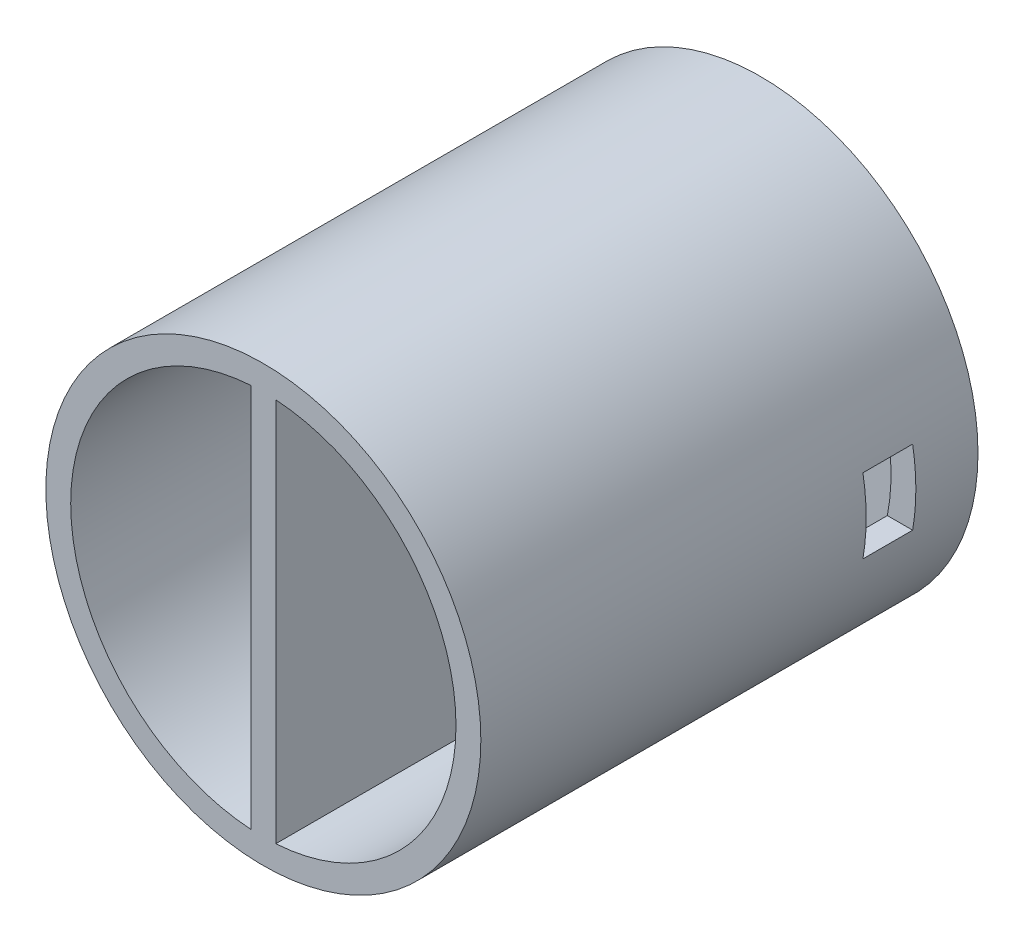
ISO-10303-21;
HEADER;
FILE_DESCRIPTION(('STEP AP214'),'2;1');
FILE_NAME('part.step','',(''),(''),'','','');
FILE_SCHEMA(('AUTOMOTIVE_DESIGN { 1 0 10303 214 1 1 1 1 }'));
ENDSEC;
DATA;
#1=APPLICATION_CONTEXT('core data for automotive mechanical design processes');
#2=APPLICATION_PROTOCOL_DEFINITION('international standard','automotive_design',2000,#1);
#3=PRODUCT_CONTEXT('',#1,'mechanical');
#4=PRODUCT('Part','Part','',(#3));
#5=PRODUCT_RELATED_PRODUCT_CATEGORY('part','',(#4));
#6=PRODUCT_DEFINITION_FORMATION('','',#4);
#7=PRODUCT_DEFINITION_CONTEXT('part definition',#1,'design');
#8=PRODUCT_DEFINITION('design','',#6,#7);
#9=PRODUCT_DEFINITION_SHAPE('','',#8);
#10=(LENGTH_UNIT() NAMED_UNIT(*) SI_UNIT(.MILLI.,.METRE.));
#11=(NAMED_UNIT(*) PLANE_ANGLE_UNIT() SI_UNIT($,.RADIAN.));
#12=(NAMED_UNIT(*) SI_UNIT($,.STERADIAN.) SOLID_ANGLE_UNIT());
#13=UNCERTAINTY_MEASURE_WITH_UNIT(LENGTH_MEASURE(1.E-05),#10,'distance_accuracy_value','');
#14=(GEOMETRIC_REPRESENTATION_CONTEXT(3) GLOBAL_UNCERTAINTY_ASSIGNED_CONTEXT((#13)) GLOBAL_UNIT_ASSIGNED_CONTEXT((#10,
#11,#12)) REPRESENTATION_CONTEXT('',''));
#15=CARTESIAN_POINT('',(0.,0.,0.));
#16=DIRECTION('',(0.,0.,1.));
#17=DIRECTION('',(1.,0.,0.));
#18=AXIS2_PLACEMENT_3D('',#15,#16,#17);
#19=CARTESIAN_POINT('',(0.,0.,2.));
#20=DIRECTION('',(0.,0.,-1.));
#21=DIRECTION('',(-1.,0.,0.));
#22=AXIS2_PLACEMENT_3D('',#19,#20,#21);
#23=CYLINDRICAL_SURFACE('',#22,17.5);
#24=DIRECTION('',(0.,0.,-1.));
#25=VECTOR('',#24,1.);
#26=CARTESIAN_POINT('',(17.2409396495667,3.,2.));
#27=LINE('',#26,#25);
#28=CARTESIAN_POINT('',(17.2409396495667,3.,9.));
#29=VERTEX_POINT('',#28);
#30=CARTESIAN_POINT('',(17.2409396495667,3.,5.));
#31=VERTEX_POINT('',#30);
#32=EDGE_CURVE('E184',#29,#31,#27,.T.);
#33=ORIENTED_EDGE('',*,*,#32,.T.);
#34=CARTESIAN_POINT('',(0.,0.,5.));
#35=DIRECTION('',(0.,0.,-1.));
#36=DIRECTION('',(0.,1.,0.));
#37=AXIS2_PLACEMENT_3D('',#34,#35,#36);
#38=CIRCLE('',#37,17.5);
#39=CARTESIAN_POINT('',(17.2409396495667,-3.,5.));
#40=VERTEX_POINT('',#39);
#41=EDGE_CURVE('E218',#31,#40,#38,.T.);
#42=ORIENTED_EDGE('',*,*,#41,.T.);
#43=DIRECTION('',(0.,0.,-1.));
#44=VECTOR('',#43,1.);
#45=CARTESIAN_POINT('',(17.2409396495667,-3.,2.));
#46=LINE('',#45,#44);
#47=CARTESIAN_POINT('',(17.2409396495667,-3.,9.));
#48=VERTEX_POINT('',#47);
#49=EDGE_CURVE('E186',#40,#48,#46,.F.);
#50=ORIENTED_EDGE('',*,*,#49,.T.);
#51=CARTESIAN_POINT('',(0.,0.,9.));
#52=DIRECTION('',(0.,0.,1.));
#53=DIRECTION('',(1.,0.,0.));
#54=AXIS2_PLACEMENT_3D('',#51,#52,#53);
#55=CIRCLE('',#54,17.5);
#56=EDGE_CURVE('E182',#48,#29,#55,.T.);
#57=ORIENTED_EDGE('',*,*,#56,.T.);
#58=EDGE_LOOP('',(#33,#42,#50,#57));
#59=FACE_BOUND('',#58,.T.);
#60=CARTESIAN_POINT('',(0.,0.,0.));
#61=DIRECTION('',(0.,0.,1.));
#62=DIRECTION('',(1.,0.,0.));
#63=AXIS2_PLACEMENT_3D('',#60,#61,#62);
#64=CIRCLE('',#63,17.5);
#65=CARTESIAN_POINT('',(17.5,0.,0.));
#66=VERTEX_POINT('',#65);
#67=EDGE_CURVE('E11',#66,#66,#64,.T.);
#68=ORIENTED_EDGE('',*,*,#67,.T.);
#69=EDGE_LOOP('',(#68));
#70=FACE_BOUND('',#69,.T.);
#71=CARTESIAN_POINT('',(0.,0.,40.));
#72=DIRECTION('',(0.,0.,1.));
#73=DIRECTION('',(1.,0.,0.));
#74=AXIS2_PLACEMENT_3D('',#71,#72,#73);
#75=CIRCLE('',#74,17.5);
#76=CARTESIAN_POINT('',(17.5,0.,40.));
#77=VERTEX_POINT('',#76);
#78=EDGE_CURVE('E53',#77,#77,#75,.T.);
#79=ORIENTED_EDGE('',*,*,#78,.F.);
#80=EDGE_LOOP('',(#79));
#81=FACE_BOUND('',#80,.T.);
#82=CARTESIAN_POINT('',(0.,0.,9.));
#83=DIRECTION('',(0.,0.,-1.));
#84=DIRECTION('',(-1.,0.,0.));
#85=AXIS2_PLACEMENT_3D('',#82,#83,#84);
#86=CIRCLE('',#85,17.5);
#87=CARTESIAN_POINT('',(-17.2409396495667,-3.,9.));
#88=VERTEX_POINT('',#87);
#89=CARTESIAN_POINT('',(-17.2409396495667,3.,9.));
#90=VERTEX_POINT('',#89);
#91=EDGE_CURVE('E268',#88,#90,#86,.T.);
#92=ORIENTED_EDGE('',*,*,#91,.F.);
#93=DIRECTION('',(0.,0.,-1.));
#94=VECTOR('',#93,1.);
#95=CARTESIAN_POINT('',(-17.2409396495667,-3.,2.));
#96=LINE('',#95,#94);
#97=CARTESIAN_POINT('',(-17.2409396495667,-3.,5.));
#98=VERTEX_POINT('',#97);
#99=EDGE_CURVE('E246',#98,#88,#96,.F.);
#100=ORIENTED_EDGE('',*,*,#99,.F.);
#101=CARTESIAN_POINT('',(0.,0.,5.));
#102=DIRECTION('',(0.,0.,1.));
#103=DIRECTION('',(0.,-1.,0.));
#104=AXIS2_PLACEMENT_3D('',#101,#102,#103);
#105=CIRCLE('',#104,17.5);
#106=CARTESIAN_POINT('',(-17.2409396495667,3.,5.));
#107=VERTEX_POINT('',#106);
#108=EDGE_CURVE('E254',#107,#98,#105,.T.);
#109=ORIENTED_EDGE('',*,*,#108,.F.);
#110=DIRECTION('',(0.,0.,-1.));
#111=VECTOR('',#110,1.);
#112=CARTESIAN_POINT('',(-17.2409396495667,3.,2.));
#113=LINE('',#112,#111);
#114=EDGE_CURVE('E261',#90,#107,#113,.T.);
#115=ORIENTED_EDGE('',*,*,#114,.F.);
#116=EDGE_LOOP('',(#92,#100,#109,#115));
#117=FACE_BOUND('',#116,.T.);
#118=ADVANCED_FACE('F45',(#59,#70,#81,#117),#23,.T.);
#119=CARTESIAN_POINT('',(0.,0.,40.));
#120=DIRECTION('',(0.,0.,-1.));
#121=DIRECTION('',(-1.,0.,0.));
#122=AXIS2_PLACEMENT_3D('',#119,#120,#121);
#123=CYLINDRICAL_SURFACE('',#122,15.5);
#124=CARTESIAN_POINT('',(0.,0.,2.));
#125=DIRECTION('',(0.,0.,1.));
#126=DIRECTION('',(1.,0.,0.));
#127=AXIS2_PLACEMENT_3D('',#124,#125,#126);
#128=CIRCLE('',#127,15.5);
#129=CARTESIAN_POINT('',(-1.,15.467708298258,2.));
#130=VERTEX_POINT('',#129);
#131=CARTESIAN_POINT('',(-0.999999999999998,-15.467708298258,2.));
#132=VERTEX_POINT('',#131);
#133=EDGE_CURVE('E380',#130,#132,#128,.T.);
#134=ORIENTED_EDGE('',*,*,#133,.F.);
#135=DIRECTION('',(0.,0.,-1.));
#136=VECTOR('',#135,1.);
#137=CARTESIAN_POINT('',(-1.,15.467708298258,40.));
#138=LINE('',#137,#136);
#139=CARTESIAN_POINT('',(-1.,15.467708298258,40.));
#140=VERTEX_POINT('',#139);
#141=EDGE_CURVE('E389',#140,#130,#138,.T.);
#142=ORIENTED_EDGE('',*,*,#141,.F.);
#143=CARTESIAN_POINT('',(0.,0.,40.));
#144=DIRECTION('',(0.,0.,1.));
#145=DIRECTION('',(1.,0.,0.));
#146=AXIS2_PLACEMENT_3D('',#143,#144,#145);
#147=CIRCLE('',#146,15.5);
#148=CARTESIAN_POINT('',(-0.999999999999998,-15.467708298258,40.));
#149=VERTEX_POINT('',#148);
#150=EDGE_CURVE('E381',#140,#149,#147,.T.);
#151=ORIENTED_EDGE('',*,*,#150,.T.);
#152=DIRECTION('',(0.,0.,-1.));
#153=VECTOR('',#152,1.);
#154=CARTESIAN_POINT('',(-0.999999999999998,-15.467708298258,40.));
#155=LINE('',#154,#153);
#156=EDGE_CURVE('E397',#149,#132,#155,.T.);
#157=ORIENTED_EDGE('',*,*,#156,.T.);
#158=EDGE_LOOP('',(#134,#142,#151,#157));
#159=FACE_BOUND('',#158,.T.);
#160=DIRECTION('',(0.,0.,-1.));
#161=VECTOR('',#160,1.);
#162=CARTESIAN_POINT('',(-15.2069063257455,-3.,40.));
#163=LINE('',#162,#161);
#164=CARTESIAN_POINT('',(-15.2069063257455,-3.,5.));
#165=VERTEX_POINT('',#164);
#166=CARTESIAN_POINT('',(-15.2069063257455,-3.,9.));
#167=VERTEX_POINT('',#166);
#168=EDGE_CURVE('E242',#165,#167,#163,.F.);
#169=ORIENTED_EDGE('',*,*,#168,.T.);
#170=CARTESIAN_POINT('',(0.,0.,9.));
#171=DIRECTION('',(0.,0.,-1.));
#172=DIRECTION('',(-1.,0.,0.));
#173=AXIS2_PLACEMENT_3D('',#170,#171,#172);
#174=CIRCLE('',#173,15.5);
#175=CARTESIAN_POINT('',(-15.2069063257455,3.,9.));
#176=VERTEX_POINT('',#175);
#177=EDGE_CURVE('E264',#167,#176,#174,.T.);
#178=ORIENTED_EDGE('',*,*,#177,.T.);
#179=DIRECTION('',(0.,0.,-1.));
#180=VECTOR('',#179,1.);
#181=CARTESIAN_POINT('',(-15.2069063257455,3.,40.));
#182=LINE('',#181,#180);
#183=CARTESIAN_POINT('',(-15.2069063257455,3.,5.));
#184=VERTEX_POINT('',#183);
#185=EDGE_CURVE('E257',#176,#184,#182,.T.);
#186=ORIENTED_EDGE('',*,*,#185,.T.);
#187=CARTESIAN_POINT('',(0.,0.,5.));
#188=DIRECTION('',(0.,0.,1.));
#189=DIRECTION('',(0.,-1.,0.));
#190=AXIS2_PLACEMENT_3D('',#187,#188,#189);
#191=CIRCLE('',#190,15.5);
#192=EDGE_CURVE('E250',#184,#165,#191,.T.);
#193=ORIENTED_EDGE('',*,*,#192,.T.);
#194=EDGE_LOOP('',(#169,#178,#186,#193));
#195=FACE_BOUND('',#194,.T.);
#196=ADVANCED_FACE('F409',(#159,#195),#123,.F.);
#197=CARTESIAN_POINT('',(0.,0.,0.));
#198=DIRECTION('',(0.,0.,1.));
#199=DIRECTION('',(1.,0.,0.));
#200=AXIS2_PLACEMENT_3D('',#197,#198,#199);
#201=PLANE('',#200);
#202=DIRECTION('',(1.,0.,0.));
#203=VECTOR('',#202,1.);
#204=CARTESIAN_POINT('',(5.,-3.,0.));
#205=LINE('',#204,#203);
#206=CARTESIAN_POINT('',(5.,-3.,0.));
#207=VERTEX_POINT('',#206);
#208=CARTESIAN_POINT('',(9.,-3.,0.));
#209=VERTEX_POINT('',#208);
#210=EDGE_CURVE('E285',#207,#209,#205,.T.);
#211=ORIENTED_EDGE('',*,*,#210,.T.);
#212=DIRECTION('',(0.,1.,0.));
#213=VECTOR('',#212,1.);
#214=CARTESIAN_POINT('',(9.,3.,0.));
#215=LINE('',#214,#213);
#216=CARTESIAN_POINT('',(9.,3.,0.));
#217=VERTEX_POINT('',#216);
#218=EDGE_CURVE('E272',#209,#217,#215,.T.);
#219=ORIENTED_EDGE('',*,*,#218,.T.);
#220=DIRECTION('',(-1.,0.,0.));
#221=VECTOR('',#220,1.);
#222=CARTESIAN_POINT('',(5.,3.,0.));
#223=LINE('',#222,#221);
#224=CARTESIAN_POINT('',(5.,3.,0.));
#225=VERTEX_POINT('',#224);
#226=EDGE_CURVE('E276',#217,#225,#223,.T.);
#227=ORIENTED_EDGE('',*,*,#226,.T.);
#228=DIRECTION('',(0.,-1.,0.));
#229=VECTOR('',#228,1.);
#230=CARTESIAN_POINT('',(5.,3.,0.));
#231=LINE('',#230,#229);
#232=EDGE_CURVE('E281',#225,#207,#231,.T.);
#233=ORIENTED_EDGE('',*,*,#232,.T.);
#234=EDGE_LOOP('',(#211,#219,#227,#233));
#235=FACE_BOUND('',#234,.T.);
#236=DIRECTION('',(1.,0.,0.));
#237=VECTOR('',#236,1.);
#238=CARTESIAN_POINT('',(-5.,-3.,0.));
#239=LINE('',#238,#237);
#240=CARTESIAN_POINT('',(-9.,-3.,0.));
#241=VERTEX_POINT('',#240);
#242=CARTESIAN_POINT('',(-5.,-3.,0.));
#243=VERTEX_POINT('',#242);
#244=EDGE_CURVE('E322',#241,#243,#239,.T.);
#245=ORIENTED_EDGE('',*,*,#244,.T.);
#246=DIRECTION('',(0.,1.,0.));
#247=VECTOR('',#246,1.);
#248=CARTESIAN_POINT('',(-5.,3.,0.));
#249=LINE('',#248,#247);
#250=CARTESIAN_POINT('',(-5.,3.,0.));
#251=VERTEX_POINT('',#250);
#252=EDGE_CURVE('E336',#243,#251,#249,.T.);
#253=ORIENTED_EDGE('',*,*,#252,.T.);
#254=DIRECTION('',(-1.,0.,0.));
#255=VECTOR('',#254,1.);
#256=CARTESIAN_POINT('',(-5.,3.,0.));
#257=LINE('',#256,#255);
#258=CARTESIAN_POINT('',(-9.,3.,0.));
#259=VERTEX_POINT('',#258);
#260=EDGE_CURVE('E353',#251,#259,#257,.T.);
#261=ORIENTED_EDGE('',*,*,#260,.T.);
#262=DIRECTION('',(0.,-1.,0.));
#263=VECTOR('',#262,1.);
#264=CARTESIAN_POINT('',(-9.,3.,0.));
#265=LINE('',#264,#263);
#266=EDGE_CURVE('E349',#259,#241,#265,.T.);
#267=ORIENTED_EDGE('',*,*,#266,.T.);
#268=EDGE_LOOP('',(#245,#253,#261,#267));
#269=FACE_BOUND('',#268,.T.);
#270=ORIENTED_EDGE('',*,*,#67,.F.);
#271=EDGE_LOOP('',(#270));
#272=FACE_BOUND('',#271,.T.);
#273=ADVANCED_FACE('F485',(#235,#269,#272),#201,.F.);
#274=CARTESIAN_POINT('',(0.,0.,40.));
#275=DIRECTION('',(0.,0.,1.));
#276=DIRECTION('',(1.,0.,0.));
#277=AXIS2_PLACEMENT_3D('',#274,#275,#276);
#278=PLANE('',#277);
#279=ORIENTED_EDGE('',*,*,#78,.T.);
#280=EDGE_LOOP('',(#279));
#281=FACE_BOUND('',#280,.T.);
#282=DIRECTION('',(0.,1.,0.));
#283=VECTOR('',#282,1.);
#284=CARTESIAN_POINT('',(-1.,15.467708298258,40.));
#285=LINE('',#284,#283);
#286=EDGE_CURVE('E385',#149,#140,#285,.T.);
#287=ORIENTED_EDGE('',*,*,#286,.F.);
#288=ORIENTED_EDGE('',*,*,#150,.F.);
#289=EDGE_LOOP('',(#287,#288));
#290=FACE_BOUND('',#289,.T.);
#291=DIRECTION('',(0.,-1.,0.));
#292=VECTOR('',#291,1.);
#293=CARTESIAN_POINT('',(0.999999999999999,15.467708298258,40.));
#294=LINE('',#293,#292);
#295=CARTESIAN_POINT('',(0.999999999999999,15.467708298258,40.));
#296=VERTEX_POINT('',#295);
#297=CARTESIAN_POINT('',(1.,-15.467708298258,40.));
#298=VERTEX_POINT('',#297);
#299=EDGE_CURVE('E364',#296,#298,#294,.T.);
#300=ORIENTED_EDGE('',*,*,#299,.F.);
#301=CARTESIAN_POINT('',(0.,0.,40.));
#302=DIRECTION('',(0.,0.,1.));
#303=DIRECTION('',(1.,0.,0.));
#304=AXIS2_PLACEMENT_3D('',#301,#302,#303);
#305=CIRCLE('',#304,15.5);
#306=EDGE_CURVE('E360',#298,#296,#305,.T.);
#307=ORIENTED_EDGE('',*,*,#306,.F.);
#308=EDGE_LOOP('',(#300,#307));
#309=FACE_BOUND('',#308,.T.);
#310=ADVANCED_FACE('F404',(#281,#290,#309),#278,.T.);
#311=CARTESIAN_POINT('',(-1.,15.467708298258,40.));
#312=DIRECTION('',(-1.,0.,0.));
#313=DIRECTION('',(0.,-1.,0.));
#314=AXIS2_PLACEMENT_3D('',#311,#312,#313);
#315=PLANE('',#314);
#316=DIRECTION('',(0.,1.,0.));
#317=VECTOR('',#316,1.);
#318=CARTESIAN_POINT('',(-1.,15.467708298258,2.));
#319=LINE('',#318,#317);
#320=EDGE_CURVE('E386',#132,#130,#319,.T.);
#321=ORIENTED_EDGE('',*,*,#320,.F.);
#322=ORIENTED_EDGE('',*,*,#156,.F.);
#323=ORIENTED_EDGE('',*,*,#286,.T.);
#324=ORIENTED_EDGE('',*,*,#141,.T.);
#325=EDGE_LOOP('',(#321,#322,#323,#324));
#326=FACE_BOUND('',#325,.T.);
#327=ADVANCED_FACE('F478',(#326),#315,.T.);
#328=CARTESIAN_POINT('',(0.,0.,40.));
#329=DIRECTION('',(0.,0.,-1.));
#330=DIRECTION('',(-1.,0.,0.));
#331=AXIS2_PLACEMENT_3D('',#328,#329,#330);
#332=CYLINDRICAL_SURFACE('',#331,15.5);
#333=CARTESIAN_POINT('',(0.,0.,9.));
#334=DIRECTION('',(0.,0.,1.));
#335=DIRECTION('',(1.,0.,0.));
#336=AXIS2_PLACEMENT_3D('',#333,#334,#335);
#337=CIRCLE('',#336,15.5);
#338=CARTESIAN_POINT('',(15.2069063257455,-3.,9.));
#339=VERTEX_POINT('',#338);
#340=CARTESIAN_POINT('',(15.2069063257455,3.,9.));
#341=VERTEX_POINT('',#340);
#342=EDGE_CURVE('E192',#339,#341,#337,.T.);
#343=ORIENTED_EDGE('',*,*,#342,.F.);
#344=DIRECTION('',(0.,0.,-1.));
#345=VECTOR('',#344,1.);
#346=CARTESIAN_POINT('',(15.2069063257455,-3.,40.));
#347=LINE('',#346,#345);
#348=CARTESIAN_POINT('',(15.2069063257455,-3.,5.));
#349=VERTEX_POINT('',#348);
#350=EDGE_CURVE('E221',#349,#339,#347,.F.);
#351=ORIENTED_EDGE('',*,*,#350,.F.);
#352=CARTESIAN_POINT('',(0.,0.,5.));
#353=DIRECTION('',(0.,0.,-1.));
#354=DIRECTION('',(0.,1.,0.));
#355=AXIS2_PLACEMENT_3D('',#352,#353,#354);
#356=CIRCLE('',#355,15.5);
#357=CARTESIAN_POINT('',(15.2069063257455,3.,5.));
#358=VERTEX_POINT('',#357);
#359=EDGE_CURVE('E196',#358,#349,#356,.T.);
#360=ORIENTED_EDGE('',*,*,#359,.F.);
#361=DIRECTION('',(0.,0.,-1.));
#362=VECTOR('',#361,1.);
#363=CARTESIAN_POINT('',(15.2069063257455,3.,40.));
#364=LINE('',#363,#362);
#365=EDGE_CURVE('E197',#341,#358,#364,.T.);
#366=ORIENTED_EDGE('',*,*,#365,.F.);
#367=EDGE_LOOP('',(#343,#351,#360,#366));
#368=FACE_BOUND('',#367,.T.);
#369=CARTESIAN_POINT('',(0.,0.,2.));
#370=DIRECTION('',(0.,0.,1.));
#371=DIRECTION('',(1.,0.,0.));
#372=AXIS2_PLACEMENT_3D('',#369,#370,#371);
#373=CIRCLE('',#372,15.5);
#374=CARTESIAN_POINT('',(1.,-15.467708298258,2.));
#375=VERTEX_POINT('',#374);
#376=CARTESIAN_POINT('',(0.999999999999999,15.467708298258,2.));
#377=VERTEX_POINT('',#376);
#378=EDGE_CURVE('E308',#375,#377,#373,.T.);
#379=ORIENTED_EDGE('',*,*,#378,.F.);
#380=DIRECTION('',(0.,0.,-1.));
#381=VECTOR('',#380,1.);
#382=CARTESIAN_POINT('',(1.,-15.467708298258,40.));
#383=LINE('',#382,#381);
#384=EDGE_CURVE('E368',#298,#375,#383,.T.);
#385=ORIENTED_EDGE('',*,*,#384,.F.);
#386=ORIENTED_EDGE('',*,*,#306,.T.);
#387=DIRECTION('',(0.,0.,-1.));
#388=VECTOR('',#387,1.);
#389=CARTESIAN_POINT('',(0.999999999999999,15.467708298258,40.));
#390=LINE('',#389,#388);
#391=EDGE_CURVE('E376',#296,#377,#390,.T.);
#392=ORIENTED_EDGE('',*,*,#391,.T.);
#393=EDGE_LOOP('',(#379,#385,#386,#392));
#394=FACE_BOUND('',#393,.T.);
#395=ADVANCED_FACE('F474',(#368,#394),#332,.F.);
#396=CARTESIAN_POINT('',(0.999999999999999,15.467708298258,40.));
#397=DIRECTION('',(1.,0.,0.));
#398=DIRECTION('',(0.,1.,0.));
#399=AXIS2_PLACEMENT_3D('',#396,#397,#398);
#400=PLANE('',#399);
#401=DIRECTION('',(0.,-1.,0.));
#402=VECTOR('',#401,1.);
#403=CARTESIAN_POINT('',(0.999999999999999,15.467708298258,2.));
#404=LINE('',#403,#402);
#405=EDGE_CURVE('E365',#377,#375,#404,.T.);
#406=ORIENTED_EDGE('',*,*,#405,.F.);
#407=ORIENTED_EDGE('',*,*,#391,.F.);
#408=ORIENTED_EDGE('',*,*,#299,.T.);
#409=ORIENTED_EDGE('',*,*,#384,.T.);
#410=EDGE_LOOP('',(#406,#407,#408,#409));
#411=FACE_BOUND('',#410,.T.);
#412=ADVANCED_FACE('F470',(#411),#400,.T.);
#413=CARTESIAN_POINT('',(0.,0.,2.));
#414=DIRECTION('',(0.,0.,1.));
#415=DIRECTION('',(1.,0.,0.));
#416=AXIS2_PLACEMENT_3D('',#413,#414,#415);
#417=PLANE('',#416);
#418=DIRECTION('',(0.,1.,0.));
#419=VECTOR('',#418,1.);
#420=CARTESIAN_POINT('',(9.,3.,2.));
#421=LINE('',#420,#419);
#422=CARTESIAN_POINT('',(9.,-3.,2.));
#423=VERTEX_POINT('',#422);
#424=CARTESIAN_POINT('',(9.,3.,2.));
#425=VERTEX_POINT('',#424);
#426=EDGE_CURVE('E290',#423,#425,#421,.T.);
#427=ORIENTED_EDGE('',*,*,#426,.F.);
#428=DIRECTION('',(1.,0.,0.));
#429=VECTOR('',#428,1.);
#430=CARTESIAN_POINT('',(5.,-3.,2.));
#431=LINE('',#430,#429);
#432=CARTESIAN_POINT('',(5.,-3.,2.));
#433=VERTEX_POINT('',#432);
#434=EDGE_CURVE('E277',#433,#423,#431,.T.);
#435=ORIENTED_EDGE('',*,*,#434,.F.);
#436=DIRECTION('',(0.,-1.,0.));
#437=VECTOR('',#436,1.);
#438=CARTESIAN_POINT('',(5.,3.,2.));
#439=LINE('',#438,#437);
#440=CARTESIAN_POINT('',(5.,3.,2.));
#441=VERTEX_POINT('',#440);
#442=EDGE_CURVE('E298',#441,#433,#439,.T.);
#443=ORIENTED_EDGE('',*,*,#442,.F.);
#444=DIRECTION('',(-1.,0.,0.));
#445=VECTOR('',#444,1.);
#446=CARTESIAN_POINT('',(5.,3.,2.));
#447=LINE('',#446,#445);
#448=EDGE_CURVE('E293',#425,#441,#447,.T.);
#449=ORIENTED_EDGE('',*,*,#448,.F.);
#450=EDGE_LOOP('',(#427,#435,#443,#449));
#451=FACE_BOUND('',#450,.T.);
#452=ORIENTED_EDGE('',*,*,#378,.T.);
#453=ORIENTED_EDGE('',*,*,#405,.T.);
#454=EDGE_LOOP('',(#452,#453));
#455=FACE_BOUND('',#454,.T.);
#456=ADVANCED_FACE('F473',(#451,#455),#417,.T.);
#457=DIRECTION('',(0.,1.,0.));
#458=VECTOR('',#457,1.);
#459=CARTESIAN_POINT('',(-5.,3.,2.));
#460=LINE('',#459,#458);
#461=CARTESIAN_POINT('',(-5.,-3.,2.));
#462=VERTEX_POINT('',#461);
#463=CARTESIAN_POINT('',(-5.,3.,2.));
#464=VERTEX_POINT('',#463);
#465=EDGE_CURVE('E294',#462,#464,#460,.T.);
#466=ORIENTED_EDGE('',*,*,#465,.F.);
#467=DIRECTION('',(1.,0.,0.));
#468=VECTOR('',#467,1.);
#469=CARTESIAN_POINT('',(-5.,-3.,2.));
#470=LINE('',#469,#468);
#471=CARTESIAN_POINT('',(-9.,-3.,2.));
#472=VERTEX_POINT('',#471);
#473=EDGE_CURVE('E331',#472,#462,#470,.T.);
#474=ORIENTED_EDGE('',*,*,#473,.F.);
#475=DIRECTION('',(0.,-1.,0.));
#476=VECTOR('',#475,1.);
#477=CARTESIAN_POINT('',(-9.,3.,2.));
#478=LINE('',#477,#476);
#479=CARTESIAN_POINT('',(-9.,3.,2.));
#480=VERTEX_POINT('',#479);
#481=EDGE_CURVE('E335',#480,#472,#478,.T.);
#482=ORIENTED_EDGE('',*,*,#481,.F.);
#483=DIRECTION('',(-1.,0.,0.));
#484=VECTOR('',#483,1.);
#485=CARTESIAN_POINT('',(-5.,3.,2.));
#486=LINE('',#485,#484);
#487=EDGE_CURVE('E340',#464,#480,#486,.T.);
#488=ORIENTED_EDGE('',*,*,#487,.F.);
#489=EDGE_LOOP('',(#466,#474,#482,#488));
#490=FACE_BOUND('',#489,.T.);
#491=ORIENTED_EDGE('',*,*,#133,.T.);
#492=ORIENTED_EDGE('',*,*,#320,.T.);
#493=EDGE_LOOP('',(#491,#492));
#494=FACE_BOUND('',#493,.T.);
#495=ADVANCED_FACE('F458',(#490,#494),#417,.T.);
#496=CARTESIAN_POINT('',(-5.,3.,0.));
#497=DIRECTION('',(1.,0.,0.));
#498=DIRECTION('',(0.,1.,0.));
#499=AXIS2_PLACEMENT_3D('',#496,#497,#498);
#500=PLANE('',#499);
#501=ORIENTED_EDGE('',*,*,#465,.T.);
#502=DIRECTION('',(0.,0.,1.));
#503=VECTOR('',#502,1.);
#504=CARTESIAN_POINT('',(-5.,3.,0.));
#505=LINE('',#504,#503);
#506=EDGE_CURVE('E318',#251,#464,#505,.T.);
#507=ORIENTED_EDGE('',*,*,#506,.F.);
#508=ORIENTED_EDGE('',*,*,#252,.F.);
#509=DIRECTION('',(0.,0.,1.));
#510=VECTOR('',#509,1.);
#511=CARTESIAN_POINT('',(-5.,-3.,0.));
#512=LINE('',#511,#510);
#513=EDGE_CURVE('E271',#243,#462,#512,.T.);
#514=ORIENTED_EDGE('',*,*,#513,.T.);
#515=EDGE_LOOP('',(#501,#507,#508,#514));
#516=FACE_BOUND('',#515,.T.);
#517=ADVANCED_FACE('F454',(#516),#500,.F.);
#518=CARTESIAN_POINT('',(-5.,-3.,0.));
#519=DIRECTION('',(0.,-1.,0.));
#520=DIRECTION('',(1.,0.,0.));
#521=AXIS2_PLACEMENT_3D('',#518,#519,#520);
#522=PLANE('',#521);
#523=ORIENTED_EDGE('',*,*,#473,.T.);
#524=ORIENTED_EDGE('',*,*,#513,.F.);
#525=ORIENTED_EDGE('',*,*,#244,.F.);
#526=DIRECTION('',(0.,0.,1.));
#527=VECTOR('',#526,1.);
#528=CARTESIAN_POINT('',(-9.,-3.,0.));
#529=LINE('',#528,#527);
#530=EDGE_CURVE('E326',#241,#472,#529,.T.);
#531=ORIENTED_EDGE('',*,*,#530,.T.);
#532=EDGE_LOOP('',(#523,#524,#525,#531));
#533=FACE_BOUND('',#532,.T.);
#534=ADVANCED_FACE('F457',(#533),#522,.F.);
#535=CARTESIAN_POINT('',(-9.,3.,0.));
#536=DIRECTION('',(-1.,0.,0.));
#537=DIRECTION('',(0.,0.,1.));
#538=AXIS2_PLACEMENT_3D('',#535,#536,#537);
#539=PLANE('',#538);
#540=ORIENTED_EDGE('',*,*,#481,.T.);
#541=ORIENTED_EDGE('',*,*,#530,.F.);
#542=ORIENTED_EDGE('',*,*,#266,.F.);
#543=DIRECTION('',(0.,0.,1.));
#544=VECTOR('',#543,1.);
#545=CARTESIAN_POINT('',(-9.,3.,0.));
#546=LINE('',#545,#544);
#547=EDGE_CURVE('E323',#259,#480,#546,.T.);
#548=ORIENTED_EDGE('',*,*,#547,.T.);
#549=EDGE_LOOP('',(#540,#541,#542,#548));
#550=FACE_BOUND('',#549,.T.);
#551=ADVANCED_FACE('F462',(#550),#539,.F.);
#552=CARTESIAN_POINT('',(-5.,3.,0.));
#553=DIRECTION('',(0.,1.,0.));
#554=DIRECTION('',(-1.,0.,0.));
#555=AXIS2_PLACEMENT_3D('',#552,#553,#554);
#556=PLANE('',#555);
#557=ORIENTED_EDGE('',*,*,#487,.T.);
#558=ORIENTED_EDGE('',*,*,#547,.F.);
#559=ORIENTED_EDGE('',*,*,#260,.F.);
#560=ORIENTED_EDGE('',*,*,#506,.T.);
#561=EDGE_LOOP('',(#557,#558,#559,#560));
#562=FACE_BOUND('',#561,.T.);
#563=ADVANCED_FACE('F452',(#562),#556,.F.);
#564=CARTESIAN_POINT('',(9.,3.,0.));
#565=DIRECTION('',(1.,0.,0.));
#566=DIRECTION('',(0.,0.,-1.));
#567=AXIS2_PLACEMENT_3D('',#564,#565,#566);
#568=PLANE('',#567);
#569=ORIENTED_EDGE('',*,*,#426,.T.);
#570=DIRECTION('',(0.,0.,1.));
#571=VECTOR('',#570,1.);
#572=CARTESIAN_POINT('',(9.,3.,0.));
#573=LINE('',#572,#571);
#574=EDGE_CURVE('E289',#217,#425,#573,.T.);
#575=ORIENTED_EDGE('',*,*,#574,.F.);
#576=ORIENTED_EDGE('',*,*,#218,.F.);
#577=DIRECTION('',(0.,0.,1.));
#578=VECTOR('',#577,1.);
#579=CARTESIAN_POINT('',(9.,-3.,0.));
#580=LINE('',#579,#578);
#581=EDGE_CURVE('E305',#209,#423,#580,.T.);
#582=ORIENTED_EDGE('',*,*,#581,.T.);
#583=EDGE_LOOP('',(#569,#575,#576,#582));
#584=FACE_BOUND('',#583,.T.);
#585=ADVANCED_FACE('F442',(#584),#568,.F.);
#586=CARTESIAN_POINT('',(5.,-3.,0.));
#587=DIRECTION('',(0.,-1.,0.));
#588=DIRECTION('',(1.,0.,0.));
#589=AXIS2_PLACEMENT_3D('',#586,#587,#588);
#590=PLANE('',#589);
#591=ORIENTED_EDGE('',*,*,#434,.T.);
#592=ORIENTED_EDGE('',*,*,#581,.F.);
#593=ORIENTED_EDGE('',*,*,#210,.F.);
#594=DIRECTION('',(0.,0.,1.));
#595=VECTOR('',#594,1.);
#596=CARTESIAN_POINT('',(5.,-3.,0.));
#597=LINE('',#596,#595);
#598=EDGE_CURVE('E309',#207,#433,#597,.T.);
#599=ORIENTED_EDGE('',*,*,#598,.T.);
#600=EDGE_LOOP('',(#591,#592,#593,#599));
#601=FACE_BOUND('',#600,.T.);
#602=ADVANCED_FACE('F438',(#601),#590,.F.);
#603=CARTESIAN_POINT('',(5.,3.,0.));
#604=DIRECTION('',(-1.,0.,0.));
#605=DIRECTION('',(0.,-1.,0.));
#606=AXIS2_PLACEMENT_3D('',#603,#604,#605);
#607=PLANE('',#606);
#608=ORIENTED_EDGE('',*,*,#442,.T.);
#609=ORIENTED_EDGE('',*,*,#598,.F.);
#610=ORIENTED_EDGE('',*,*,#232,.F.);
#611=DIRECTION('',(0.,0.,1.));
#612=VECTOR('',#611,1.);
#613=CARTESIAN_POINT('',(5.,3.,0.));
#614=LINE('',#613,#612);
#615=EDGE_CURVE('E312',#225,#441,#614,.T.);
#616=ORIENTED_EDGE('',*,*,#615,.T.);
#617=EDGE_LOOP('',(#608,#609,#610,#616));
#618=FACE_BOUND('',#617,.T.);
#619=ADVANCED_FACE('F441',(#618),#607,.F.);
#620=CARTESIAN_POINT('',(5.,3.,0.));
#621=DIRECTION('',(0.,1.,0.));
#622=DIRECTION('',(-1.,0.,0.));
#623=AXIS2_PLACEMENT_3D('',#620,#621,#622);
#624=PLANE('',#623);
#625=ORIENTED_EDGE('',*,*,#448,.T.);
#626=ORIENTED_EDGE('',*,*,#615,.F.);
#627=ORIENTED_EDGE('',*,*,#226,.F.);
#628=ORIENTED_EDGE('',*,*,#574,.T.);
#629=EDGE_LOOP('',(#625,#626,#627,#628));
#630=FACE_BOUND('',#629,.T.);
#631=ADVANCED_FACE('F434',(#630),#624,.F.);
#632=CARTESIAN_POINT('',(-17.5,3.,9.));
#633=DIRECTION('',(0.,0.,-1.));
#634=DIRECTION('',(-1.,0.,0.));
#635=AXIS2_PLACEMENT_3D('',#632,#633,#634);
#636=PLANE('',#635);
#637=ORIENTED_EDGE('',*,*,#91,.T.);
#638=DIRECTION('',(1.,0.,0.));
#639=VECTOR('',#638,1.);
#640=CARTESIAN_POINT('',(-17.5,3.,9.));
#641=LINE('',#640,#639);
#642=EDGE_CURVE('E238',#90,#176,#641,.T.);
#643=ORIENTED_EDGE('',*,*,#642,.T.);
#644=ORIENTED_EDGE('',*,*,#177,.F.);
#645=DIRECTION('',(1.,0.,0.));
#646=VECTOR('',#645,1.);
#647=CARTESIAN_POINT('',(-17.5,-3.,9.));
#648=LINE('',#647,#646);
#649=EDGE_CURVE('E191',#88,#167,#648,.T.);
#650=ORIENTED_EDGE('',*,*,#649,.F.);
#651=EDGE_LOOP('',(#637,#643,#644,#650));
#652=FACE_BOUND('',#651,.T.);
#653=ADVANCED_FACE('F420',(#652),#636,.T.);
#654=CARTESIAN_POINT('',(-17.5,3.,5.));
#655=DIRECTION('',(0.,-1.,0.));
#656=DIRECTION('',(1.,0.,0.));
#657=AXIS2_PLACEMENT_3D('',#654,#655,#656);
#658=PLANE('',#657);
#659=ORIENTED_EDGE('',*,*,#114,.T.);
#660=DIRECTION('',(1.,0.,0.));
#661=VECTOR('',#660,1.);
#662=CARTESIAN_POINT('',(-17.5,3.,5.));
#663=LINE('',#662,#661);
#664=EDGE_CURVE('E234',#107,#184,#663,.T.);
#665=ORIENTED_EDGE('',*,*,#664,.T.);
#666=ORIENTED_EDGE('',*,*,#185,.F.);
#667=ORIENTED_EDGE('',*,*,#642,.F.);
#668=EDGE_LOOP('',(#659,#665,#666,#667));
#669=FACE_BOUND('',#668,.T.);
#670=ADVANCED_FACE('F426',(#669),#658,.T.);
#671=CARTESIAN_POINT('',(-17.5,3.,5.));
#672=DIRECTION('',(0.,0.,1.));
#673=DIRECTION('',(0.,-1.,0.));
#674=AXIS2_PLACEMENT_3D('',#671,#672,#673);
#675=PLANE('',#674);
#676=ORIENTED_EDGE('',*,*,#108,.T.);
#677=DIRECTION('',(1.,0.,0.));
#678=VECTOR('',#677,1.);
#679=CARTESIAN_POINT('',(-17.5,-3.,5.));
#680=LINE('',#679,#678);
#681=EDGE_CURVE('E230',#98,#165,#680,.T.);
#682=ORIENTED_EDGE('',*,*,#681,.T.);
#683=ORIENTED_EDGE('',*,*,#192,.F.);
#684=ORIENTED_EDGE('',*,*,#664,.F.);
#685=EDGE_LOOP('',(#676,#682,#683,#684));
#686=FACE_BOUND('',#685,.T.);
#687=ADVANCED_FACE('F423',(#686),#675,.T.);
#688=CARTESIAN_POINT('',(-17.5,-3.,5.));
#689=DIRECTION('',(0.,1.,0.));
#690=DIRECTION('',(-1.,0.,0.));
#691=AXIS2_PLACEMENT_3D('',#688,#689,#690);
#692=PLANE('',#691);
#693=ORIENTED_EDGE('',*,*,#99,.T.);
#694=ORIENTED_EDGE('',*,*,#649,.T.);
#695=ORIENTED_EDGE('',*,*,#168,.F.);
#696=ORIENTED_EDGE('',*,*,#681,.F.);
#697=EDGE_LOOP('',(#693,#694,#695,#696));
#698=FACE_BOUND('',#697,.T.);
#699=ADVANCED_FACE('F418',(#698),#692,.T.);
#700=CARTESIAN_POINT('',(17.5,3.,9.));
#701=DIRECTION('',(0.,0.,1.));
#702=DIRECTION('',(1.,0.,0.));
#703=AXIS2_PLACEMENT_3D('',#700,#701,#702);
#704=PLANE('',#703);
#705=ORIENTED_EDGE('',*,*,#56,.F.);
#706=DIRECTION('',(-1.,0.,0.));
#707=VECTOR('',#706,1.);
#708=CARTESIAN_POINT('',(17.5,-3.,9.));
#709=LINE('',#708,#707);
#710=EDGE_CURVE('E211',#48,#339,#709,.T.);
#711=ORIENTED_EDGE('',*,*,#710,.T.);
#712=ORIENTED_EDGE('',*,*,#342,.T.);
#713=DIRECTION('',(-1.,0.,0.));
#714=VECTOR('',#713,1.);
#715=CARTESIAN_POINT('',(17.5,3.,9.));
#716=LINE('',#715,#714);
#717=EDGE_CURVE('E65',#29,#341,#716,.T.);
#718=ORIENTED_EDGE('',*,*,#717,.F.);
#719=EDGE_LOOP('',(#705,#711,#712,#718));
#720=FACE_BOUND('',#719,.T.);
#721=ADVANCED_FACE('F199',(#720),#704,.F.);
#722=CARTESIAN_POINT('',(17.5,-3.,5.));
#723=DIRECTION('',(0.,-1.,0.));
#724=DIRECTION('',(1.,0.,0.));
#725=AXIS2_PLACEMENT_3D('',#722,#723,#724);
#726=PLANE('',#725);
#727=DIRECTION('',(-1.,0.,0.));
#728=VECTOR('',#727,1.);
#729=CARTESIAN_POINT('',(17.5,-3.,5.));
#730=LINE('',#729,#728);
#731=EDGE_CURVE('E205',#40,#349,#730,.T.);
#732=ORIENTED_EDGE('',*,*,#731,.T.);
#733=ORIENTED_EDGE('',*,*,#350,.T.);
#734=ORIENTED_EDGE('',*,*,#710,.F.);
#735=ORIENTED_EDGE('',*,*,#49,.F.);
#736=EDGE_LOOP('',(#732,#733,#734,#735));
#737=FACE_BOUND('',#736,.T.);
#738=ADVANCED_FACE('F617',(#737),#726,.F.);
#739=CARTESIAN_POINT('',(17.5,3.,5.));
#740=DIRECTION('',(0.,0.,-1.));
#741=DIRECTION('',(0.,1.,0.));
#742=AXIS2_PLACEMENT_3D('',#739,#740,#741);
#743=PLANE('',#742);
#744=DIRECTION('',(-1.,0.,0.));
#745=VECTOR('',#744,1.);
#746=CARTESIAN_POINT('',(17.5,3.,5.));
#747=LINE('',#746,#745);
#748=EDGE_CURVE('E60',#31,#358,#747,.T.);
#749=ORIENTED_EDGE('',*,*,#748,.T.);
#750=ORIENTED_EDGE('',*,*,#359,.T.);
#751=ORIENTED_EDGE('',*,*,#731,.F.);
#752=ORIENTED_EDGE('',*,*,#41,.F.);
#753=EDGE_LOOP('',(#749,#750,#751,#752));
#754=FACE_BOUND('',#753,.T.);
#755=ADVANCED_FACE('F626',(#754),#743,.F.);
#756=CARTESIAN_POINT('',(17.5,3.,5.));
#757=DIRECTION('',(0.,1.,0.));
#758=DIRECTION('',(-1.,0.,0.));
#759=AXIS2_PLACEMENT_3D('',#756,#757,#758);
#760=PLANE('',#759);
#761=ORIENTED_EDGE('',*,*,#717,.T.);
#762=ORIENTED_EDGE('',*,*,#365,.T.);
#763=ORIENTED_EDGE('',*,*,#748,.F.);
#764=ORIENTED_EDGE('',*,*,#32,.F.);
#765=EDGE_LOOP('',(#761,#762,#763,#764));
#766=FACE_BOUND('',#765,.T.);
#767=ADVANCED_FACE('F194',(#766),#760,.F.);
#768=CLOSED_SHELL('',(#118,#196,#273,#310,#327,#395,#412,#456,#495,#517,#534,#551,#563,#585,
#602,#619,#631,#653,#670,#687,#699,#721,#738,#755,#767));
#769=MANIFOLD_SOLID_BREP('B2',#768);
#770=ADVANCED_BREP_SHAPE_REPRESENTATION('',(#18,#769),#14);
#771=SHAPE_DEFINITION_REPRESENTATION(#9,#770);
ENDSEC;
END-ISO-10303-21;
